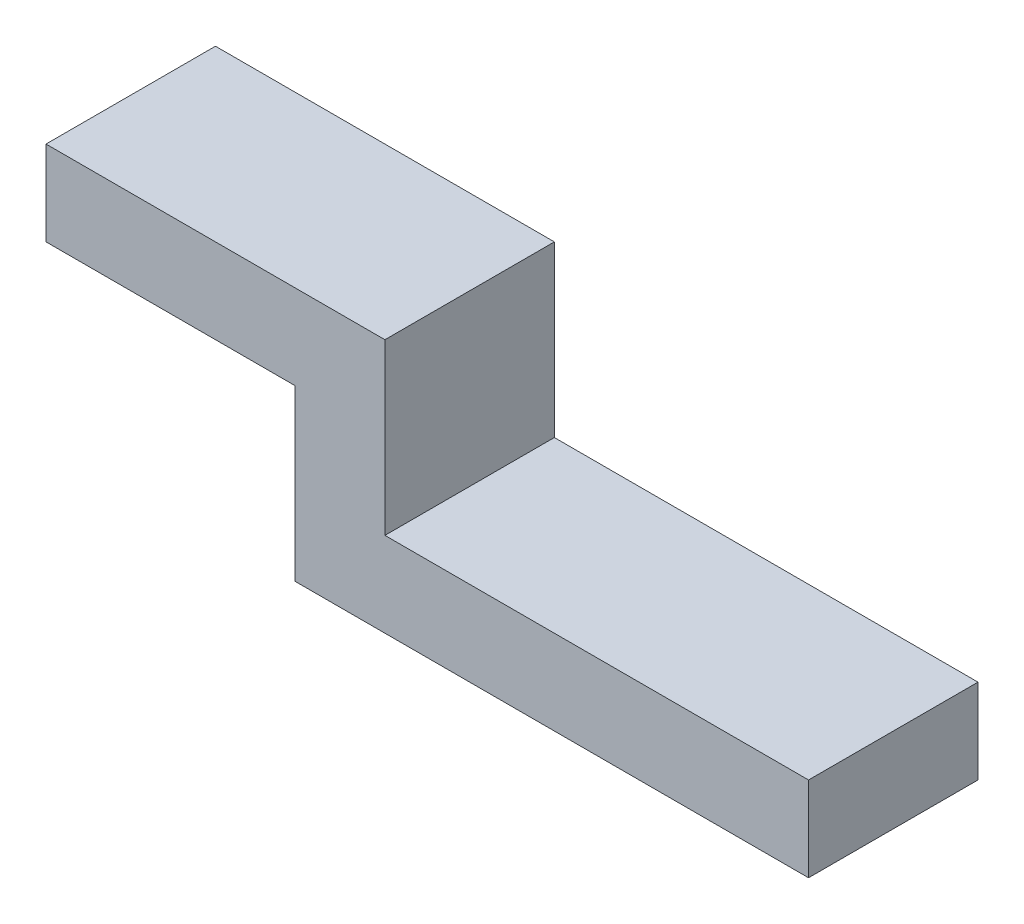
ISO-10303-21;
HEADER;
FILE_DESCRIPTION(('STEP AP214'),'2;1');
FILE_NAME('part.step','',(''),(''),'','','');
FILE_SCHEMA(('AUTOMOTIVE_DESIGN { 1 0 10303 214 1 1 1 1 }'));
ENDSEC;
DATA;
#1=APPLICATION_CONTEXT('core data for automotive mechanical design processes');
#2=APPLICATION_PROTOCOL_DEFINITION('international standard','automotive_design',2000,#1);
#3=PRODUCT_CONTEXT('',#1,'mechanical');
#4=PRODUCT('Part','Part','',(#3));
#5=PRODUCT_RELATED_PRODUCT_CATEGORY('part','',(#4));
#6=PRODUCT_DEFINITION_FORMATION('','',#4);
#7=PRODUCT_DEFINITION_CONTEXT('part definition',#1,'design');
#8=PRODUCT_DEFINITION('design','',#6,#7);
#9=PRODUCT_DEFINITION_SHAPE('','',#8);
#10=(LENGTH_UNIT() NAMED_UNIT(*) SI_UNIT(.MILLI.,.METRE.));
#11=(NAMED_UNIT(*) PLANE_ANGLE_UNIT() SI_UNIT($,.RADIAN.));
#12=(NAMED_UNIT(*) SI_UNIT($,.STERADIAN.) SOLID_ANGLE_UNIT());
#13=UNCERTAINTY_MEASURE_WITH_UNIT(LENGTH_MEASURE(1.E-05),#10,'distance_accuracy_value','');
#14=(GEOMETRIC_REPRESENTATION_CONTEXT(3) GLOBAL_UNCERTAINTY_ASSIGNED_CONTEXT((#13)) GLOBAL_UNIT_ASSIGNED_CONTEXT((#10,
#11,#12)) REPRESENTATION_CONTEXT('',''));
#15=CARTESIAN_POINT('',(0.,0.,0.));
#16=DIRECTION('',(0.,0.,1.));
#17=DIRECTION('',(1.,0.,0.));
#18=AXIS2_PLACEMENT_3D('',#15,#16,#17);
#19=CARTESIAN_POINT('',(0.,19.5592974657861,2.54));
#20=DIRECTION('',(1.,0.,0.));
#21=DIRECTION('',(0.,0.,-1.));
#22=AXIS2_PLACEMENT_3D('',#19,#20,#21);
#23=PLANE('',#22);
#24=DIRECTION('',(0.,-1.,0.));
#25=VECTOR('',#24,1.);
#26=CARTESIAN_POINT('',(0.,19.5592974657861,0.));
#27=LINE('',#26,#25);
#28=CARTESIAN_POINT('',(0.,22.0992974657861,0.));
#29=VERTEX_POINT('',#28);
#30=CARTESIAN_POINT('',(0.,19.5592974657861,0.));
#31=VERTEX_POINT('',#30);
#32=EDGE_CURVE('E129',#29,#31,#27,.T.);
#33=ORIENTED_EDGE('',*,*,#32,.T.);
#34=DIRECTION('',(0.,0.,-1.));
#35=VECTOR('',#34,1.);
#36=CARTESIAN_POINT('',(0.,19.5592974657861,2.54));
#37=LINE('',#36,#35);
#38=CARTESIAN_POINT('',(0.,19.5592974657861,2.54));
#39=VERTEX_POINT('',#38);
#40=EDGE_CURVE('E11',#39,#31,#37,.T.);
#41=ORIENTED_EDGE('',*,*,#40,.F.);
#42=DIRECTION('',(0.,-1.,0.));
#43=VECTOR('',#42,1.);
#44=CARTESIAN_POINT('',(0.,19.5592974657861,2.54));
#45=LINE('',#44,#43);
#46=CARTESIAN_POINT('',(0.,22.0992974657861,2.54));
#47=VERTEX_POINT('',#46);
#48=EDGE_CURVE('E143',#47,#39,#45,.T.);
#49=ORIENTED_EDGE('',*,*,#48,.F.);
#50=DIRECTION('',(0.,0.,-1.));
#51=VECTOR('',#50,1.);
#52=CARTESIAN_POINT('',(0.,22.0992974657861,2.54));
#53=LINE('',#52,#51);
#54=EDGE_CURVE('E125',#47,#29,#53,.T.);
#55=ORIENTED_EDGE('',*,*,#54,.T.);
#56=EDGE_LOOP('',(#33,#41,#49,#55));
#57=FACE_BOUND('',#56,.T.);
#58=ADVANCED_FACE('F33',(#57),#23,.F.);
#59=CARTESIAN_POINT('',(0.,19.5592974657861,2.54));
#60=DIRECTION('',(0.,1.,0.));
#61=DIRECTION('',(0.,0.,1.));
#62=AXIS2_PLACEMENT_3D('',#59,#60,#61);
#63=PLANE('',#62);
#64=DIRECTION('',(1.,0.,0.));
#65=VECTOR('',#64,1.);
#66=CARTESIAN_POINT('',(0.,19.5592974657861,0.));
#67=LINE('',#66,#65);
#68=CARTESIAN_POINT('',(7.69442442085761,19.5592974657861,0.));
#69=VERTEX_POINT('',#68);
#70=EDGE_CURVE('E132',#31,#69,#67,.T.);
#71=ORIENTED_EDGE('',*,*,#70,.T.);
#72=DIRECTION('',(0.,0.,-1.));
#73=VECTOR('',#72,1.);
#74=CARTESIAN_POINT('',(7.69442442085761,19.5592974657861,2.54));
#75=LINE('',#74,#73);
#76=CARTESIAN_POINT('',(7.69442442085761,19.5592974657861,2.54));
#77=VERTEX_POINT('',#76);
#78=EDGE_CURVE('E41',#77,#69,#75,.T.);
#79=ORIENTED_EDGE('',*,*,#78,.F.);
#80=DIRECTION('',(1.,0.,0.));
#81=VECTOR('',#80,1.);
#82=CARTESIAN_POINT('',(0.,19.5592974657861,2.54));
#83=LINE('',#82,#81);
#84=EDGE_CURVE('E92',#39,#77,#83,.T.);
#85=ORIENTED_EDGE('',*,*,#84,.F.);
#86=ORIENTED_EDGE('',*,*,#40,.T.);
#87=EDGE_LOOP('',(#71,#79,#85,#86));
#88=FACE_BOUND('',#87,.T.);
#89=ADVANCED_FACE('F178',(#88),#63,.F.);
#90=CARTESIAN_POINT('',(7.69442442085761,20.8292974657861,2.54));
#91=DIRECTION('',(-1.,0.,0.));
#92=DIRECTION('',(0.,-1.,0.));
#93=AXIS2_PLACEMENT_3D('',#90,#91,#92);
#94=PLANE('',#93);
#95=DIRECTION('',(0.,1.,0.));
#96=VECTOR('',#95,1.);
#97=CARTESIAN_POINT('',(7.69442442085761,20.8292974657861,0.));
#98=LINE('',#97,#96);
#99=CARTESIAN_POINT('',(7.69442442085761,20.8292974657861,0.));
#100=VERTEX_POINT('',#99);
#101=EDGE_CURVE('E134',#69,#100,#98,.T.);
#102=ORIENTED_EDGE('',*,*,#101,.T.);
#103=DIRECTION('',(0.,0.,-1.));
#104=VECTOR('',#103,1.);
#105=CARTESIAN_POINT('',(7.69442442085761,20.8292974657861,2.54));
#106=LINE('',#105,#104);
#107=CARTESIAN_POINT('',(7.69442442085761,20.8292974657861,2.54));
#108=VERTEX_POINT('',#107);
#109=EDGE_CURVE('E150',#108,#100,#106,.T.);
#110=ORIENTED_EDGE('',*,*,#109,.F.);
#111=DIRECTION('',(0.,1.,0.));
#112=VECTOR('',#111,1.);
#113=CARTESIAN_POINT('',(7.69442442085761,20.8292974657861,2.54));
#114=LINE('',#113,#112);
#115=EDGE_CURVE('E158',#77,#108,#114,.T.);
#116=ORIENTED_EDGE('',*,*,#115,.F.);
#117=ORIENTED_EDGE('',*,*,#78,.T.);
#118=EDGE_LOOP('',(#102,#110,#116,#117));
#119=FACE_BOUND('',#118,.T.);
#120=ADVANCED_FACE('F156',(#119),#94,.F.);
#121=CARTESIAN_POINT('',(1.34442442085761,20.8292974657861,2.54));
#122=DIRECTION('',(0.,-1.,0.));
#123=DIRECTION('',(0.,0.,-1.));
#124=AXIS2_PLACEMENT_3D('',#121,#122,#123);
#125=PLANE('',#124);
#126=DIRECTION('',(-1.,0.,0.));
#127=VECTOR('',#126,1.);
#128=CARTESIAN_POINT('',(1.34442442085761,20.8292974657861,0.));
#129=LINE('',#128,#127);
#130=CARTESIAN_POINT('',(1.34442442085761,20.8292974657861,0.));
#131=VERTEX_POINT('',#130);
#132=EDGE_CURVE('E136',#100,#131,#129,.T.);
#133=ORIENTED_EDGE('',*,*,#132,.T.);
#134=DIRECTION('',(0.,0.,-1.));
#135=VECTOR('',#134,1.);
#136=CARTESIAN_POINT('',(1.34442442085761,20.8292974657861,2.54));
#137=LINE('',#136,#135);
#138=CARTESIAN_POINT('',(1.34442442085761,20.8292974657861,2.54));
#139=VERTEX_POINT('',#138);
#140=EDGE_CURVE('E147',#139,#131,#137,.T.);
#141=ORIENTED_EDGE('',*,*,#140,.F.);
#142=DIRECTION('',(-1.,0.,0.));
#143=VECTOR('',#142,1.);
#144=CARTESIAN_POINT('',(1.34442442085761,20.8292974657861,2.54));
#145=LINE('',#144,#143);
#146=EDGE_CURVE('E170',#108,#139,#145,.T.);
#147=ORIENTED_EDGE('',*,*,#146,.F.);
#148=ORIENTED_EDGE('',*,*,#109,.T.);
#149=EDGE_LOOP('',(#133,#141,#147,#148));
#150=FACE_BOUND('',#149,.T.);
#151=ADVANCED_FACE('F166',(#150),#125,.F.);
#152=CARTESIAN_POINT('',(1.34442442085761,23.3692974657861,2.54));
#153=DIRECTION('',(-1.,0.,0.));
#154=DIRECTION('',(0.,-1.,0.));
#155=AXIS2_PLACEMENT_3D('',#152,#153,#154);
#156=PLANE('',#155);
#157=DIRECTION('',(0.,1.,0.));
#158=VECTOR('',#157,1.);
#159=CARTESIAN_POINT('',(1.34442442085761,23.3692974657861,0.));
#160=LINE('',#159,#158);
#161=CARTESIAN_POINT('',(1.34442442085761,23.3692974657861,0.));
#162=VERTEX_POINT('',#161);
#163=EDGE_CURVE('E138',#131,#162,#160,.T.);
#164=ORIENTED_EDGE('',*,*,#163,.T.);
#165=DIRECTION('',(0.,0.,-1.));
#166=VECTOR('',#165,1.);
#167=CARTESIAN_POINT('',(1.34442442085761,23.3692974657861,2.54));
#168=LINE('',#167,#166);
#169=CARTESIAN_POINT('',(1.34442442085761,23.3692974657861,2.54));
#170=VERTEX_POINT('',#169);
#171=EDGE_CURVE('E120',#170,#162,#168,.T.);
#172=ORIENTED_EDGE('',*,*,#171,.F.);
#173=DIRECTION('',(0.,1.,0.));
#174=VECTOR('',#173,1.);
#175=CARTESIAN_POINT('',(1.34442442085761,23.3692974657861,2.54));
#176=LINE('',#175,#174);
#177=EDGE_CURVE('E111',#139,#170,#176,.T.);
#178=ORIENTED_EDGE('',*,*,#177,.F.);
#179=ORIENTED_EDGE('',*,*,#140,.T.);
#180=EDGE_LOOP('',(#164,#172,#178,#179));
#181=FACE_BOUND('',#180,.T.);
#182=ADVANCED_FACE('F169',(#181),#156,.F.);
#183=CARTESIAN_POINT('',(-3.73557557914239,23.3692974657861,2.54));
#184=DIRECTION('',(0.,-1.,0.));
#185=DIRECTION('',(0.,0.,-1.));
#186=AXIS2_PLACEMENT_3D('',#183,#184,#185);
#187=PLANE('',#186);
#188=DIRECTION('',(-1.,0.,0.));
#189=VECTOR('',#188,1.);
#190=CARTESIAN_POINT('',(-3.73557557914239,23.3692974657861,0.));
#191=LINE('',#190,#189);
#192=CARTESIAN_POINT('',(-3.73557557914239,23.3692974657861,0.));
#193=VERTEX_POINT('',#192);
#194=EDGE_CURVE('E119',#162,#193,#191,.T.);
#195=ORIENTED_EDGE('',*,*,#194,.T.);
#196=DIRECTION('',(0.,0.,-1.));
#197=VECTOR('',#196,1.);
#198=CARTESIAN_POINT('',(-3.73557557914239,23.3692974657861,2.54));
#199=LINE('',#198,#197);
#200=CARTESIAN_POINT('',(-3.73557557914239,23.3692974657861,2.54));
#201=VERTEX_POINT('',#200);
#202=EDGE_CURVE('E116',#201,#193,#199,.T.);
#203=ORIENTED_EDGE('',*,*,#202,.F.);
#204=DIRECTION('',(-1.,0.,0.));
#205=VECTOR('',#204,1.);
#206=CARTESIAN_POINT('',(-3.73557557914239,23.3692974657861,2.54));
#207=LINE('',#206,#205);
#208=EDGE_CURVE('E105',#170,#201,#207,.T.);
#209=ORIENTED_EDGE('',*,*,#208,.F.);
#210=ORIENTED_EDGE('',*,*,#171,.T.);
#211=EDGE_LOOP('',(#195,#203,#209,#210));
#212=FACE_BOUND('',#211,.T.);
#213=ADVANCED_FACE('F117',(#212),#187,.F.);
#214=CARTESIAN_POINT('',(-3.73557557914239,22.0992974657861,2.54));
#215=DIRECTION('',(1.,0.,0.));
#216=DIRECTION('',(0.,0.,-1.));
#217=AXIS2_PLACEMENT_3D('',#214,#215,#216);
#218=PLANE('',#217);
#219=DIRECTION('',(0.,-1.,0.));
#220=VECTOR('',#219,1.);
#221=CARTESIAN_POINT('',(-3.73557557914239,22.0992974657861,0.));
#222=LINE('',#221,#220);
#223=CARTESIAN_POINT('',(-3.73557557914239,22.0992974657861,0.));
#224=VERTEX_POINT('',#223);
#225=EDGE_CURVE('E78',#193,#224,#222,.T.);
#226=ORIENTED_EDGE('',*,*,#225,.T.);
#227=DIRECTION('',(0.,0.,-1.));
#228=VECTOR('',#227,1.);
#229=CARTESIAN_POINT('',(-3.73557557914239,22.0992974657861,2.54));
#230=LINE('',#229,#228);
#231=CARTESIAN_POINT('',(-3.73557557914239,22.0992974657861,2.54));
#232=VERTEX_POINT('',#231);
#233=EDGE_CURVE('E121',#232,#224,#230,.T.);
#234=ORIENTED_EDGE('',*,*,#233,.F.);
#235=DIRECTION('',(0.,-1.,0.));
#236=VECTOR('',#235,1.);
#237=CARTESIAN_POINT('',(-3.73557557914239,22.0992974657861,2.54));
#238=LINE('',#237,#236);
#239=EDGE_CURVE('E109',#201,#232,#238,.T.);
#240=ORIENTED_EDGE('',*,*,#239,.F.);
#241=ORIENTED_EDGE('',*,*,#202,.T.);
#242=EDGE_LOOP('',(#226,#234,#240,#241));
#243=FACE_BOUND('',#242,.T.);
#244=ADVANCED_FACE('F123',(#243),#218,.F.);
#245=CARTESIAN_POINT('',(0.,22.0992974657861,2.54));
#246=DIRECTION('',(0.,1.,0.));
#247=DIRECTION('',(0.,0.,1.));
#248=AXIS2_PLACEMENT_3D('',#245,#246,#247);
#249=PLANE('',#248);
#250=DIRECTION('',(1.,0.,0.));
#251=VECTOR('',#250,1.);
#252=CARTESIAN_POINT('',(0.,22.0992974657861,0.));
#253=LINE('',#252,#251);
#254=EDGE_CURVE('E84',#224,#29,#253,.T.);
#255=ORIENTED_EDGE('',*,*,#254,.T.);
#256=ORIENTED_EDGE('',*,*,#54,.F.);
#257=DIRECTION('',(1.,0.,0.));
#258=VECTOR('',#257,1.);
#259=CARTESIAN_POINT('',(0.,22.0992974657861,2.54));
#260=LINE('',#259,#258);
#261=EDGE_CURVE('E49',#232,#47,#260,.T.);
#262=ORIENTED_EDGE('',*,*,#261,.F.);
#263=ORIENTED_EDGE('',*,*,#233,.T.);
#264=EDGE_LOOP('',(#255,#256,#262,#263));
#265=FACE_BOUND('',#264,.T.);
#266=ADVANCED_FACE('F194',(#265),#249,.F.);
#267=CARTESIAN_POINT('',(0.,0.,2.54));
#268=DIRECTION('',(0.,0.,1.));
#269=DIRECTION('',(1.,0.,0.));
#270=AXIS2_PLACEMENT_3D('',#267,#268,#269);
#271=PLANE('',#270);
#272=ORIENTED_EDGE('',*,*,#48,.T.);
#273=ORIENTED_EDGE('',*,*,#84,.T.);
#274=ORIENTED_EDGE('',*,*,#115,.T.);
#275=ORIENTED_EDGE('',*,*,#146,.T.);
#276=ORIENTED_EDGE('',*,*,#177,.T.);
#277=ORIENTED_EDGE('',*,*,#208,.T.);
#278=ORIENTED_EDGE('',*,*,#239,.T.);
#279=ORIENTED_EDGE('',*,*,#261,.T.);
#280=EDGE_LOOP('',(#272,#273,#274,#275,#276,#277,#278,#279));
#281=FACE_BOUND('',#280,.T.);
#282=ADVANCED_FACE('F107',(#281),#271,.T.);
#283=CARTESIAN_POINT('',(0.,0.,0.));
#284=DIRECTION('',(0.,0.,1.));
#285=DIRECTION('',(1.,0.,0.));
#286=AXIS2_PLACEMENT_3D('',#283,#284,#285);
#287=PLANE('',#286);
#288=ORIENTED_EDGE('',*,*,#32,.F.);
#289=ORIENTED_EDGE('',*,*,#254,.F.);
#290=ORIENTED_EDGE('',*,*,#225,.F.);
#291=ORIENTED_EDGE('',*,*,#194,.F.);
#292=ORIENTED_EDGE('',*,*,#163,.F.);
#293=ORIENTED_EDGE('',*,*,#132,.F.);
#294=ORIENTED_EDGE('',*,*,#101,.F.);
#295=ORIENTED_EDGE('',*,*,#70,.F.);
#296=EDGE_LOOP('',(#288,#289,#290,#291,#292,#293,#294,#295));
#297=FACE_BOUND('',#296,.T.);
#298=ADVANCED_FACE('F162',(#297),#287,.F.);
#299=CLOSED_SHELL('',(#58,#89,#120,#151,#182,#213,#244,#266,#282,#298));
#300=MANIFOLD_SOLID_BREP('B2',#299);
#301=ADVANCED_BREP_SHAPE_REPRESENTATION('',(#18,#300),#14);
#302=SHAPE_DEFINITION_REPRESENTATION(#9,#301);
ENDSEC;
END-ISO-10303-21;
